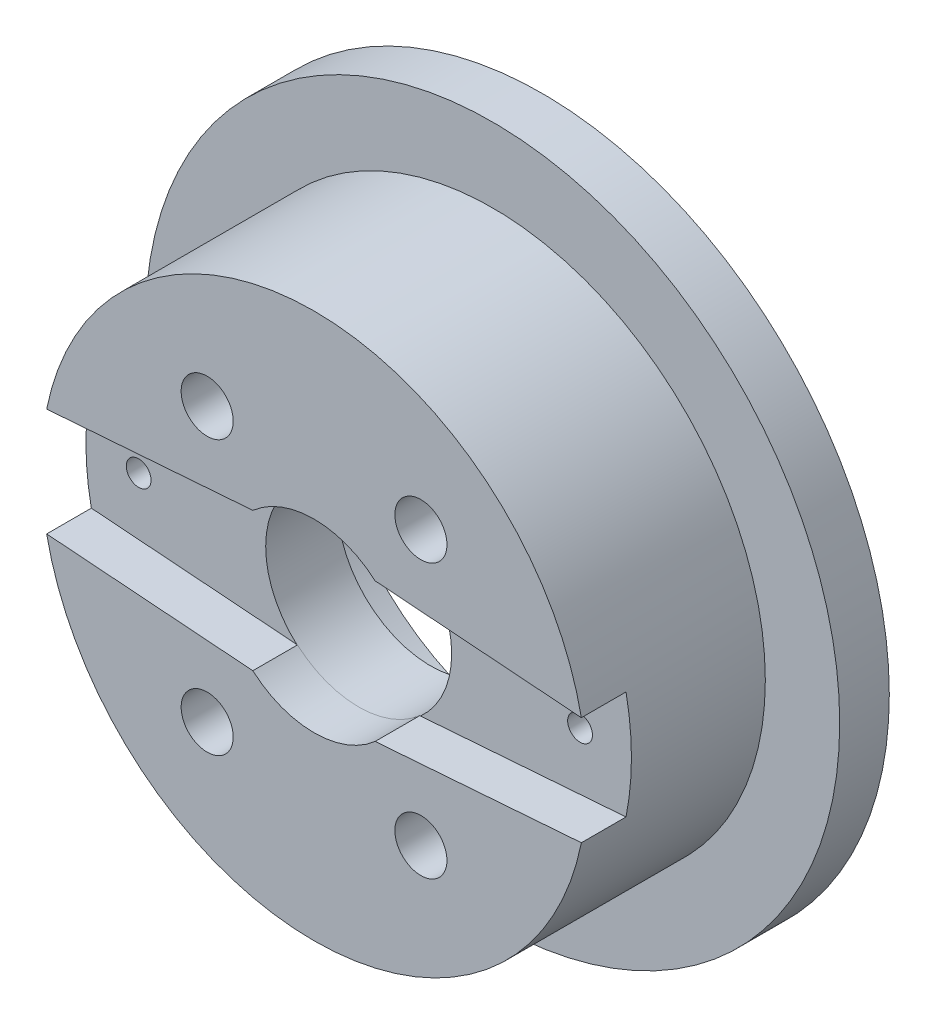
ISO-10303-21;
HEADER;
FILE_DESCRIPTION(('STEP AP214'),'2;1');
FILE_NAME('part.step','',(''),(''),'','','');
FILE_SCHEMA(('AUTOMOTIVE_DESIGN { 1 0 10303 214 1 1 1 1 }'));
ENDSEC;
DATA;
#1=APPLICATION_CONTEXT('core data for automotive mechanical design processes');
#2=APPLICATION_PROTOCOL_DEFINITION('international standard','automotive_design',2000,#1);
#3=PRODUCT_CONTEXT('',#1,'mechanical');
#4=PRODUCT('Part','Part','',(#3));
#5=PRODUCT_RELATED_PRODUCT_CATEGORY('part','',(#4));
#6=PRODUCT_DEFINITION_FORMATION('','',#4);
#7=PRODUCT_DEFINITION_CONTEXT('part definition',#1,'design');
#8=PRODUCT_DEFINITION('design','',#6,#7);
#9=PRODUCT_DEFINITION_SHAPE('','',#8);
#10=(LENGTH_UNIT() NAMED_UNIT(*) SI_UNIT(.MILLI.,.METRE.));
#11=(NAMED_UNIT(*) PLANE_ANGLE_UNIT() SI_UNIT($,.RADIAN.));
#12=(NAMED_UNIT(*) SI_UNIT($,.STERADIAN.) SOLID_ANGLE_UNIT());
#13=UNCERTAINTY_MEASURE_WITH_UNIT(LENGTH_MEASURE(1.E-05),#10,'distance_accuracy_value','');
#14=(GEOMETRIC_REPRESENTATION_CONTEXT(3) GLOBAL_UNCERTAINTY_ASSIGNED_CONTEXT((#13)) GLOBAL_UNIT_ASSIGNED_CONTEXT((#10,
#11,#12)) REPRESENTATION_CONTEXT('',''));
#15=CARTESIAN_POINT('',(0.,0.,0.));
#16=DIRECTION('',(0.,0.,1.));
#17=DIRECTION('',(1.,0.,0.));
#18=AXIS2_PLACEMENT_3D('',#15,#16,#17);
#19=CARTESIAN_POINT('',(0.,0.,0.));
#20=DIRECTION('',(0.,0.,1.));
#21=DIRECTION('',(1.,0.,0.));
#22=AXIS2_PLACEMENT_3D('',#19,#20,#21);
#23=CYLINDRICAL_SURFACE('',#22,9.);
#24=CARTESIAN_POINT('',(0.,0.,-7.4));
#25=DIRECTION('',(0.,0.,1.));
#26=DIRECTION('',(1.,0.,0.));
#27=AXIS2_PLACEMENT_3D('',#24,#25,#26);
#28=CIRCLE('',#27,9.);
#29=CARTESIAN_POINT('',(8.98629343397973,0.49651819544979,-7.4));
#30=VERTEX_POINT('',#29);
#31=CARTESIAN_POINT('',(-8.98682620345552,0.486780021041482,-7.4));
#32=VERTEX_POINT('',#31);
#33=EDGE_CURVE('E210',#30,#32,#28,.T.);
#34=ORIENTED_EDGE('',*,*,#33,.F.);
#35=DIRECTION('',(0.,0.,1.));
#36=VECTOR('',#35,1.);
#37=CARTESIAN_POINT('',(8.98629343397974,0.49651819544981,-2.8));
#38=LINE('',#37,#36);
#39=CARTESIAN_POINT('',(8.98629343397973,0.49651819544979,-2.9));
#40=VERTEX_POINT('',#39);
#41=EDGE_CURVE('E243',#30,#40,#38,.T.);
#42=ORIENTED_EDGE('',*,*,#41,.T.);
#43=CARTESIAN_POINT('',(0.,0.,-2.9));
#44=DIRECTION('',(0.,0.,1.));
#45=DIRECTION('',(1.,0.,0.));
#46=AXIS2_PLACEMENT_3D('',#43,#44,#45);
#47=CIRCLE('',#46,9.);
#48=CARTESIAN_POINT('',(6.09458966730571,6.62238452426091,-2.9));
#49=VERTEX_POINT('',#48);
#50=EDGE_CURVE('E185',#40,#49,#47,.T.);
#51=ORIENTED_EDGE('',*,*,#50,.T.);
#52=CARTESIAN_POINT('',(4.95125671642993,7.51565412509167,-2.9));
#53=VERTEX_POINT('',#52);
#54=EDGE_CURVE('E192',#49,#53,#47,.T.);
#55=ORIENTED_EDGE('',*,*,#54,.T.);
#56=CARTESIAN_POINT('',(-4.95125671642993,7.51565412509167,-2.9));
#57=VERTEX_POINT('',#56);
#58=EDGE_CURVE('E197',#53,#57,#47,.T.);
#59=ORIENTED_EDGE('',*,*,#58,.T.);
#60=CARTESIAN_POINT('',(-6.09458966730571,6.62238452426091,-2.9));
#61=VERTEX_POINT('',#60);
#62=EDGE_CURVE('E200',#57,#61,#47,.T.);
#63=ORIENTED_EDGE('',*,*,#62,.T.);
#64=CARTESIAN_POINT('',(-8.98682620345553,0.486780021041481,-2.9));
#65=VERTEX_POINT('',#64);
#66=EDGE_CURVE('E203',#61,#65,#47,.T.);
#67=ORIENTED_EDGE('',*,*,#66,.T.);
#68=DIRECTION('',(0.,0.,1.));
#69=VECTOR('',#68,1.);
#70=CARTESIAN_POINT('',(-8.98682620345552,0.486780021041482,-2.8));
#71=LINE('',#70,#69);
#72=EDGE_CURVE('E251',#65,#32,#71,.F.);
#73=ORIENTED_EDGE('',*,*,#72,.T.);
#74=EDGE_LOOP('',(#34,#42,#51,#55,#59,#63,#67,#73));
#75=FACE_BOUND('',#74,.T.);
#76=ADVANCED_FACE('F32',(#75),#23,.F.);
#77=CARTESIAN_POINT('',(-11.,0.,0.));
#78=DIRECTION('',(0.,0.,-1.));
#79=DIRECTION('',(-1.,0.,0.));
#80=AXIS2_PLACEMENT_3D('',#77,#78,#79);
#81=PLANE('',#80);
#82=DIRECTION('',(-0.997224303626801,-0.0744559484261798,0.));
#83=VECTOR('',#82,1.);
#84=CARTESIAN_POINT('',(2.46325017898811,-2.80446302050426,0.));
#85=LINE('',#84,#83);
#86=CARTESIAN_POINT('',(10.7811251698424,-2.18342393322763,0.));
#87=VERTEX_POINT('',#86);
#88=CARTESIAN_POINT('',(2.49188137304874,-2.80232532420002,0.));
#89=VERTEX_POINT('',#88);
#90=EDGE_CURVE('E271',#87,#89,#85,.T.);
#91=ORIENTED_EDGE('',*,*,#90,.F.);
#92=CARTESIAN_POINT('',(0.,0.,0.));
#93=DIRECTION('',(0.,0.,1.));
#94=DIRECTION('',(1.,0.,0.));
#95=AXIS2_PLACEMENT_3D('',#92,#93,#94);
#96=CIRCLE('',#95,11.);
#97=CARTESIAN_POINT('',(10.7811251698424,2.18342393322763,0.));
#98=VERTEX_POINT('',#97);
#99=EDGE_CURVE('E333',#87,#98,#96,.T.);
#100=ORIENTED_EDGE('',*,*,#99,.T.);
#101=DIRECTION('',(0.997224303626801,-0.0744559484261799,0.));
#102=VECTOR('',#101,1.);
#103=CARTESIAN_POINT('',(10.7811251698424,2.18342393322763,0.));
#104=LINE('',#103,#102);
#105=CARTESIAN_POINT('',(2.49188137304874,2.80232532420002,0.));
#106=VERTEX_POINT('',#105);
#107=EDGE_CURVE('E187',#106,#98,#104,.T.);
#108=ORIENTED_EDGE('',*,*,#107,.F.);
#109=CARTESIAN_POINT('',(0.,0.,0.));
#110=DIRECTION('',(0.,0.,1.));
#111=DIRECTION('',(1.,0.,0.));
#112=AXIS2_PLACEMENT_3D('',#109,#110,#111);
#113=CIRCLE('',#112,3.75);
#114=EDGE_CURVE('E418',#89,#106,#113,.T.);
#115=ORIENTED_EDGE('',*,*,#114,.F.);
#116=EDGE_LOOP('',(#91,#100,#108,#115));
#117=FACE_BOUND('',#116,.T.);
#118=CARTESIAN_POINT('',(8.9273894308283,0.,0.));
#119=DIRECTION('',(0.,0.,-1.));
#120=DIRECTION('',(-1.,0.,0.));
#121=AXIS2_PLACEMENT_3D('',#118,#119,#120);
#122=CIRCLE('',#121,0.500000000000001);
#123=CARTESIAN_POINT('',(8.4273894308283,0.,0.));
#124=VERTEX_POINT('',#123);
#125=EDGE_CURVE('E245',#124,#124,#122,.T.);
#126=ORIENTED_EDGE('',*,*,#125,.T.);
#127=EDGE_LOOP('',(#126));
#128=FACE_BOUND('',#127,.T.);
#129=ADVANCED_FACE('F416',(#117,#128),#81,.F.);
#130=DIRECTION('',(-0.997224267834601,0.0744564278067589,0.));
#131=VECTOR('',#130,1.);
#132=CARTESIAN_POINT('',(-10.7819650213995,-2.17927287812196,0.));
#133=LINE('',#132,#131);
#134=CARTESIAN_POINT('',(-2.49688573127066,-2.79786733870228,0.));
#135=VERTEX_POINT('',#134);
#136=CARTESIAN_POINT('',(-10.7819650213995,-2.17927287812196,0.));
#137=VERTEX_POINT('',#136);
#138=EDGE_CURVE('E276',#135,#137,#133,.T.);
#139=ORIENTED_EDGE('',*,*,#138,.F.);
#140=CARTESIAN_POINT('',(-2.49688573127066,2.79786733870228,0.));
#141=VERTEX_POINT('',#140);
#142=EDGE_CURVE('E427',#141,#135,#113,.T.);
#143=ORIENTED_EDGE('',*,*,#142,.F.);
#144=DIRECTION('',(0.997224267834601,0.0744564278067591,0.));
#145=VECTOR('',#144,1.);
#146=CARTESIAN_POINT('',(-2.4683221584025,2.8,0.));
#147=LINE('',#146,#145);
#148=CARTESIAN_POINT('',(-10.7819650213995,2.17927287812196,0.));
#149=VERTEX_POINT('',#148);
#150=EDGE_CURVE('E298',#149,#141,#147,.T.);
#151=ORIENTED_EDGE('',*,*,#150,.F.);
#152=EDGE_CURVE('E318',#149,#137,#96,.T.);
#153=ORIENTED_EDGE('',*,*,#152,.T.);
#154=EDGE_LOOP('',(#139,#143,#151,#153));
#155=FACE_BOUND('',#154,.T.);
#156=CARTESIAN_POINT('',(-8.87261056917171,0.,0.));
#157=DIRECTION('',(0.,0.,-1.));
#158=DIRECTION('',(-1.,0.,0.));
#159=AXIS2_PLACEMENT_3D('',#156,#157,#158);
#160=CIRCLE('',#159,0.500000000000001);
#161=CARTESIAN_POINT('',(-9.37261056917171,0.,0.));
#162=VERTEX_POINT('',#161);
#163=EDGE_CURVE('E256',#162,#162,#160,.T.);
#164=ORIENTED_EDGE('',*,*,#163,.T.);
#165=EDGE_LOOP('',(#164));
#166=FACE_BOUND('',#165,.T.);
#167=ADVANCED_FACE('F448',(#155,#166),#81,.F.);
#168=CARTESIAN_POINT('',(0.,0.,0.));
#169=DIRECTION('',(0.,0.,1.));
#170=DIRECTION('',(1.,0.,0.));
#171=AXIS2_PLACEMENT_3D('',#168,#169,#170);
#172=CYLINDRICAL_SURFACE('',#171,3.75);
#173=CARTESIAN_POINT('',(0.,0.,-2.9));
#174=DIRECTION('',(0.,0.,1.));
#175=DIRECTION('',(1.,0.,0.));
#176=AXIS2_PLACEMENT_3D('',#173,#174,#175);
#177=CIRCLE('',#176,3.75);
#178=CARTESIAN_POINT('',(3.75,0.,-2.9));
#179=VERTEX_POINT('',#178);
#180=EDGE_CURVE('E184',#179,#179,#177,.T.);
#181=ORIENTED_EDGE('',*,*,#180,.F.);
#182=EDGE_LOOP('',(#181));
#183=FACE_BOUND('',#182,.T.);
#184=EDGE_CURVE('E335',#106,#141,#113,.T.);
#185=ORIENTED_EDGE('',*,*,#184,.T.);
#186=ORIENTED_EDGE('',*,*,#142,.T.);
#187=CARTESIAN_POINT('',(0.,0.,0.));
#188=DIRECTION('',(0.,0.,1.));
#189=DIRECTION('',(1.,0.,0.));
#190=AXIS2_PLACEMENT_3D('',#187,#188,#189);
#191=CIRCLE('',#190,3.75);
#192=EDGE_CURVE('E290',#89,#135,#191,.F.);
#193=ORIENTED_EDGE('',*,*,#192,.F.);
#194=ORIENTED_EDGE('',*,*,#114,.T.);
#195=EDGE_LOOP('',(#185,#186,#193,#194));
#196=FACE_BOUND('',#195,.T.);
#197=ADVANCED_FACE('F34',(#183,#196),#172,.F.);
#198=CARTESIAN_POINT('',(-3.75,0.,-2.9));
#199=DIRECTION('',(0.,0.,1.));
#200=DIRECTION('',(1.,0.,0.));
#201=AXIS2_PLACEMENT_3D('',#198,#199,#200);
#202=PLANE('',#201);
#203=CARTESIAN_POINT('',(-4.95125671642995,-7.51565412509166,-2.9));
#204=VERTEX_POINT('',#203);
#205=CARTESIAN_POINT('',(4.95125671642995,-7.51565412509166,-2.9));
#206=VERTEX_POINT('',#205);
#207=EDGE_CURVE('E163',#204,#206,#47,.T.);
#208=ORIENTED_EDGE('',*,*,#207,.F.);
#209=CARTESIAN_POINT('',(-4.30963032727962,-5.51607527524705,-2.9));
#210=DIRECTION('',(0.,0.,-1.));
#211=DIRECTION('',(-1.,0.,0.));
#212=AXIS2_PLACEMENT_3D('',#209,#210,#211);
#213=CIRCLE('',#212,2.1);
#214=CARTESIAN_POINT('',(-6.0945896673057,-6.62238452426092,-2.9));
#215=VERTEX_POINT('',#214);
#216=EDGE_CURVE('E169',#215,#204,#213,.T.);
#217=ORIENTED_EDGE('',*,*,#216,.F.);
#218=CARTESIAN_POINT('',(-8.98682620345553,-0.486780021041487,-2.9));
#219=VERTEX_POINT('',#218);
#220=EDGE_CURVE('E162',#219,#215,#47,.T.);
#221=ORIENTED_EDGE('',*,*,#220,.F.);
#222=CARTESIAN_POINT('',(-8.87261056917171,0.,-2.9));
#223=DIRECTION('',(0.,0.,1.));
#224=DIRECTION('',(1.,0.,0.));
#225=AXIS2_PLACEMENT_3D('',#222,#223,#224);
#226=CIRCLE('',#225,0.500000000000001);
#227=EDGE_CURVE('E253',#219,#65,#226,.T.);
#228=ORIENTED_EDGE('',*,*,#227,.T.);
#229=ORIENTED_EDGE('',*,*,#66,.F.);
#230=CARTESIAN_POINT('',(-4.30963032727962,5.51607527524705,-2.9));
#231=DIRECTION('',(0.,0.,1.));
#232=DIRECTION('',(1.,0.,0.));
#233=AXIS2_PLACEMENT_3D('',#230,#231,#232);
#234=CIRCLE('',#233,2.1);
#235=EDGE_CURVE('E11',#61,#57,#234,.T.);
#236=ORIENTED_EDGE('',*,*,#235,.T.);
#237=ORIENTED_EDGE('',*,*,#58,.F.);
#238=CARTESIAN_POINT('',(4.30963032727962,5.51607527524705,-2.9));
#239=DIRECTION('',(0.,0.,1.));
#240=DIRECTION('',(1.,0.,0.));
#241=AXIS2_PLACEMENT_3D('',#238,#239,#240);
#242=CIRCLE('',#241,2.1);
#243=EDGE_CURVE('E41',#53,#49,#242,.T.);
#244=ORIENTED_EDGE('',*,*,#243,.T.);
#245=ORIENTED_EDGE('',*,*,#50,.F.);
#246=CARTESIAN_POINT('',(8.9273894308283,0.,-2.9));
#247=DIRECTION('',(0.,0.,1.));
#248=DIRECTION('',(1.,0.,0.));
#249=AXIS2_PLACEMENT_3D('',#246,#247,#248);
#250=CIRCLE('',#249,0.500000000000001);
#251=CARTESIAN_POINT('',(8.98629343397973,-0.496518195449811,-2.9));
#252=VERTEX_POINT('',#251);
#253=EDGE_CURVE('E241',#40,#252,#250,.T.);
#254=ORIENTED_EDGE('',*,*,#253,.T.);
#255=CARTESIAN_POINT('',(6.0945896673057,-6.62238452426092,-2.9));
#256=VERTEX_POINT('',#255);
#257=EDGE_CURVE('E165',#256,#252,#47,.T.);
#258=ORIENTED_EDGE('',*,*,#257,.F.);
#259=CARTESIAN_POINT('',(4.30963032727962,-5.51607527524705,-2.9));
#260=DIRECTION('',(0.,0.,-1.));
#261=DIRECTION('',(1.,0.,0.));
#262=AXIS2_PLACEMENT_3D('',#259,#260,#261);
#263=CIRCLE('',#262,2.1);
#264=EDGE_CURVE('E218',#206,#256,#263,.T.);
#265=ORIENTED_EDGE('',*,*,#264,.F.);
#266=EDGE_LOOP('',(#208,#217,#221,#228,#229,#236,#237,#244,#245,#254,#258,#265));
#267=FACE_BOUND('',#266,.T.);
#268=ORIENTED_EDGE('',*,*,#180,.T.);
#269=EDGE_LOOP('',(#268));
#270=FACE_BOUND('',#269,.T.);
#271=ADVANCED_FACE('F175',(#267,#270),#202,.F.);
#272=ORIENTED_EDGE('',*,*,#220,.T.);
#273=EDGE_CURVE('E158',#215,#204,#47,.T.);
#274=ORIENTED_EDGE('',*,*,#273,.T.);
#275=ORIENTED_EDGE('',*,*,#207,.T.);
#276=EDGE_CURVE('E190',#206,#256,#47,.T.);
#277=ORIENTED_EDGE('',*,*,#276,.T.);
#278=ORIENTED_EDGE('',*,*,#257,.T.);
#279=DIRECTION('',(0.,0.,1.));
#280=VECTOR('',#279,1.);
#281=CARTESIAN_POINT('',(8.98629343397974,-0.49651819544981,-2.8));
#282=LINE('',#281,#280);
#283=CARTESIAN_POINT('',(8.98629343397974,-0.49651819544981,-7.4));
#284=VERTEX_POINT('',#283);
#285=EDGE_CURVE('E239',#252,#284,#282,.F.);
#286=ORIENTED_EDGE('',*,*,#285,.T.);
#287=CARTESIAN_POINT('',(-8.98682620345553,-0.486780021041487,-7.4));
#288=VERTEX_POINT('',#287);
#289=EDGE_CURVE('E205',#288,#284,#28,.T.);
#290=ORIENTED_EDGE('',*,*,#289,.F.);
#291=DIRECTION('',(0.,0.,1.));
#292=VECTOR('',#291,1.);
#293=CARTESIAN_POINT('',(-8.98682620345552,-0.486780021041482,-2.8));
#294=LINE('',#293,#292);
#295=EDGE_CURVE('E183',#288,#219,#294,.T.);
#296=ORIENTED_EDGE('',*,*,#295,.T.);
#297=EDGE_LOOP('',(#272,#274,#275,#277,#278,#286,#290,#296));
#298=FACE_BOUND('',#297,.T.);
#299=ADVANCED_FACE('F181',(#298),#23,.F.);
#300=CARTESIAN_POINT('',(-9.,0.,-7.4));
#301=DIRECTION('',(0.,0.,1.));
#302=DIRECTION('',(1.,0.,0.));
#303=AXIS2_PLACEMENT_3D('',#300,#301,#302);
#304=PLANE('',#303);
#305=CARTESIAN_POINT('',(0.,0.,-7.4));
#306=DIRECTION('',(0.,0.,1.));
#307=DIRECTION('',(1.,0.,0.));
#308=AXIS2_PLACEMENT_3D('',#305,#306,#307);
#309=CIRCLE('',#308,14.);
#310=CARTESIAN_POINT('',(14.,0.,-7.4));
#311=VERTEX_POINT('',#310);
#312=EDGE_CURVE('E484',#311,#311,#309,.T.);
#313=ORIENTED_EDGE('',*,*,#312,.F.);
#314=EDGE_LOOP('',(#313));
#315=FACE_BOUND('',#314,.T.);
#316=ORIENTED_EDGE('',*,*,#289,.T.);
#317=CARTESIAN_POINT('',(8.9273894308283,0.,-7.4));
#318=DIRECTION('',(0.,0.,1.));
#319=DIRECTION('',(1.,0.,0.));
#320=AXIS2_PLACEMENT_3D('',#317,#318,#319);
#321=CIRCLE('',#320,0.500000000000001);
#322=EDGE_CURVE('E235',#284,#30,#321,.T.);
#323=ORIENTED_EDGE('',*,*,#322,.T.);
#324=ORIENTED_EDGE('',*,*,#33,.T.);
#325=CARTESIAN_POINT('',(-8.87261056917171,0.,-7.4));
#326=DIRECTION('',(0.,0.,1.));
#327=DIRECTION('',(1.,0.,0.));
#328=AXIS2_PLACEMENT_3D('',#325,#326,#327);
#329=CIRCLE('',#328,0.500000000000001);
#330=EDGE_CURVE('E248',#32,#288,#329,.T.);
#331=ORIENTED_EDGE('',*,*,#330,.T.);
#332=EDGE_LOOP('',(#316,#323,#324,#331));
#333=FACE_BOUND('',#332,.T.);
#334=ADVANCED_FACE('F452',(#315,#333),#304,.F.);
#335=CARTESIAN_POINT('',(0.,0.,0.));
#336=DIRECTION('',(0.,0.,1.));
#337=DIRECTION('',(1.,0.,0.));
#338=AXIS2_PLACEMENT_3D('',#335,#336,#337);
#339=CYLINDRICAL_SURFACE('',#338,14.);
#340=CARTESIAN_POINT('',(0.,0.,-5.4));
#341=DIRECTION('',(0.,0.,1.));
#342=DIRECTION('',(1.,0.,0.));
#343=AXIS2_PLACEMENT_3D('',#340,#341,#342);
#344=CIRCLE('',#343,14.);
#345=CARTESIAN_POINT('',(14.,0.,-5.4));
#346=VERTEX_POINT('',#345);
#347=EDGE_CURVE('E481',#346,#346,#344,.T.);
#348=ORIENTED_EDGE('',*,*,#347,.F.);
#349=EDGE_LOOP('',(#348));
#350=FACE_BOUND('',#349,.T.);
#351=ORIENTED_EDGE('',*,*,#312,.T.);
#352=EDGE_LOOP('',(#351));
#353=FACE_BOUND('',#352,.T.);
#354=ADVANCED_FACE('F457',(#350,#353),#339,.T.);
#355=CARTESIAN_POINT('',(-14.,0.,-5.4));
#356=DIRECTION('',(0.,0.,-1.));
#357=DIRECTION('',(-1.,0.,0.));
#358=AXIS2_PLACEMENT_3D('',#355,#356,#357);
#359=PLANE('',#358);
#360=CARTESIAN_POINT('',(0.,0.,-5.4));
#361=DIRECTION('',(0.,0.,1.));
#362=DIRECTION('',(1.,0.,0.));
#363=AXIS2_PLACEMENT_3D('',#360,#361,#362);
#364=CIRCLE('',#363,11.);
#365=CARTESIAN_POINT('',(11.,0.,-5.4));
#366=VERTEX_POINT('',#365);
#367=EDGE_CURVE('E400',#366,#366,#364,.T.);
#368=ORIENTED_EDGE('',*,*,#367,.F.);
#369=EDGE_LOOP('',(#368));
#370=FACE_BOUND('',#369,.T.);
#371=ORIENTED_EDGE('',*,*,#347,.T.);
#372=EDGE_LOOP('',(#371));
#373=FACE_BOUND('',#372,.T.);
#374=ADVANCED_FACE('F440',(#370,#373),#359,.F.);
#375=CARTESIAN_POINT('',(0.,0.,0.));
#376=DIRECTION('',(0.,0.,1.));
#377=DIRECTION('',(1.,0.,0.));
#378=AXIS2_PLACEMENT_3D('',#375,#376,#377);
#379=CYLINDRICAL_SURFACE('',#378,11.);
#380=ORIENTED_EDGE('',*,*,#152,.F.);
#381=DIRECTION('',(0.,0.,-1.));
#382=VECTOR('',#381,1.);
#383=CARTESIAN_POINT('',(-10.7819650213995,2.17927287812196,1.8));
#384=LINE('',#383,#382);
#385=CARTESIAN_POINT('',(-10.7819650213995,2.17927287812196,1.8));
#386=VERTEX_POINT('',#385);
#387=EDGE_CURVE('E324',#386,#149,#384,.T.);
#388=ORIENTED_EDGE('',*,*,#387,.F.);
#389=CARTESIAN_POINT('',(0.,0.,1.8));
#390=DIRECTION('',(0.,0.,1.));
#391=DIRECTION('',(1.,0.,0.));
#392=AXIS2_PLACEMENT_3D('',#389,#390,#391);
#393=CIRCLE('',#392,11.);
#394=CARTESIAN_POINT('',(10.7811251698424,2.18342393322763,1.8));
#395=VERTEX_POINT('',#394);
#396=EDGE_CURVE('E300',#395,#386,#393,.T.);
#397=ORIENTED_EDGE('',*,*,#396,.F.);
#398=DIRECTION('',(0.,0.,-1.));
#399=VECTOR('',#398,1.);
#400=CARTESIAN_POINT('',(10.7811251698424,2.18342393322763,1.8));
#401=LINE('',#400,#399);
#402=EDGE_CURVE('E320',#395,#98,#401,.T.);
#403=ORIENTED_EDGE('',*,*,#402,.T.);
#404=ORIENTED_EDGE('',*,*,#99,.F.);
#405=DIRECTION('',(0.,0.,-1.));
#406=VECTOR('',#405,1.);
#407=CARTESIAN_POINT('',(10.7811251698424,-2.18342393322763,1.8));
#408=LINE('',#407,#406);
#409=CARTESIAN_POINT('',(10.7811251698424,-2.18342393322763,1.8));
#410=VERTEX_POINT('',#409);
#411=EDGE_CURVE('E287',#410,#87,#408,.T.);
#412=ORIENTED_EDGE('',*,*,#411,.F.);
#413=CARTESIAN_POINT('',(0.,0.,1.8));
#414=DIRECTION('',(0.,0.,1.));
#415=DIRECTION('',(1.,0.,0.));
#416=AXIS2_PLACEMENT_3D('',#413,#414,#415);
#417=CIRCLE('',#416,11.);
#418=CARTESIAN_POINT('',(-10.7819650213995,-2.17927287812196,1.8));
#419=VERTEX_POINT('',#418);
#420=EDGE_CURVE('E260',#419,#410,#417,.T.);
#421=ORIENTED_EDGE('',*,*,#420,.F.);
#422=DIRECTION('',(0.,0.,-1.));
#423=VECTOR('',#422,1.);
#424=CARTESIAN_POINT('',(-10.7819650213995,-2.17927287812196,1.8));
#425=LINE('',#424,#423);
#426=EDGE_CURVE('E270',#419,#137,#425,.T.);
#427=ORIENTED_EDGE('',*,*,#426,.T.);
#428=EDGE_LOOP('',(#380,#388,#397,#403,#404,#412,#421,#427));
#429=FACE_BOUND('',#428,.T.);
#430=ORIENTED_EDGE('',*,*,#367,.T.);
#431=EDGE_LOOP('',(#430));
#432=FACE_BOUND('',#431,.T.);
#433=ADVANCED_FACE('F382',(#429,#432),#379,.T.);
#434=CARTESIAN_POINT('',(0.,0.,1.8));
#435=DIRECTION('',(0.,0.,-1.));
#436=DIRECTION('',(-1.,0.,0.));
#437=AXIS2_PLACEMENT_3D('',#434,#435,#436);
#438=CYLINDRICAL_SURFACE('',#437,3.73264172907886);
#439=CARTESIAN_POINT('',(0.,0.,0.));
#440=DIRECTION('',(0.,0.,-1.));
#441=DIRECTION('',(1.,0.,0.));
#442=AXIS2_PLACEMENT_3D('',#439,#440,#441);
#443=CIRCLE('',#442,3.73264172907886);
#444=CARTESIAN_POINT('',(-2.4683221584025,2.8,0.));
#445=VERTEX_POINT('',#444);
#446=CARTESIAN_POINT('',(2.46325017898811,2.80446302050426,0.));
#447=VERTEX_POINT('',#446);
#448=EDGE_CURVE('E293',#445,#447,#443,.T.);
#449=ORIENTED_EDGE('',*,*,#448,.T.);
#450=DIRECTION('',(0.,0.,-1.));
#451=VECTOR('',#450,1.);
#452=CARTESIAN_POINT('',(2.46325017898811,2.80446302050426,1.8));
#453=LINE('',#452,#451);
#454=CARTESIAN_POINT('',(2.46325017898811,2.80446302050426,1.8));
#455=VERTEX_POINT('',#454);
#456=EDGE_CURVE('E323',#455,#447,#453,.T.);
#457=ORIENTED_EDGE('',*,*,#456,.F.);
#458=CARTESIAN_POINT('',(0.,0.,1.8));
#459=DIRECTION('',(0.,0.,-1.));
#460=DIRECTION('',(1.,0.,0.));
#461=AXIS2_PLACEMENT_3D('',#458,#459,#460);
#462=CIRCLE('',#461,3.73264172907886);
#463=CARTESIAN_POINT('',(-2.4683221584025,2.8,1.8));
#464=VERTEX_POINT('',#463);
#465=EDGE_CURVE('E294',#464,#455,#462,.T.);
#466=ORIENTED_EDGE('',*,*,#465,.F.);
#467=DIRECTION('',(0.,0.,-1.));
#468=VECTOR('',#467,1.);
#469=CARTESIAN_POINT('',(-2.4683221584025,2.8,1.8));
#470=LINE('',#469,#468);
#471=EDGE_CURVE('E304',#464,#445,#470,.T.);
#472=ORIENTED_EDGE('',*,*,#471,.T.);
#473=EDGE_LOOP('',(#449,#457,#466,#472));
#474=FACE_BOUND('',#473,.T.);
#475=ADVANCED_FACE('F432',(#474),#438,.F.);
#476=CARTESIAN_POINT('',(10.7811251698424,2.18342393322763,1.8));
#477=DIRECTION('',(0.0744559484261799,0.997224303626801,0.));
#478=DIRECTION('',(-0.997224303626801,0.0744559484261799,0.));
#479=AXIS2_PLACEMENT_3D('',#476,#477,#478);
#480=PLANE('',#479);
#481=EDGE_CURVE('E307',#447,#106,#104,.T.);
#482=ORIENTED_EDGE('',*,*,#481,.T.);
#483=ORIENTED_EDGE('',*,*,#107,.T.);
#484=ORIENTED_EDGE('',*,*,#402,.F.);
#485=DIRECTION('',(0.997224303626801,-0.0744559484261799,0.));
#486=VECTOR('',#485,1.);
#487=CARTESIAN_POINT('',(10.7811251698424,2.18342393322763,1.8));
#488=LINE('',#487,#486);
#489=EDGE_CURVE('E297',#455,#395,#488,.T.);
#490=ORIENTED_EDGE('',*,*,#489,.F.);
#491=ORIENTED_EDGE('',*,*,#456,.T.);
#492=EDGE_LOOP('',(#482,#483,#484,#490,#491));
#493=FACE_BOUND('',#492,.T.);
#494=ADVANCED_FACE('F411',(#493),#480,.F.);
#495=CARTESIAN_POINT('',(-2.4683221584025,2.8,1.8));
#496=DIRECTION('',(-0.0744564278067591,0.997224267834601,0.));
#497=DIRECTION('',(-0.997224267834601,-0.0744564278067591,0.));
#498=AXIS2_PLACEMENT_3D('',#495,#496,#497);
#499=PLANE('',#498);
#500=ORIENTED_EDGE('',*,*,#150,.T.);
#501=EDGE_CURVE('E311',#141,#445,#147,.T.);
#502=ORIENTED_EDGE('',*,*,#501,.T.);
#503=ORIENTED_EDGE('',*,*,#471,.F.);
#504=DIRECTION('',(0.997224267834601,0.0744564278067591,0.));
#505=VECTOR('',#504,1.);
#506=CARTESIAN_POINT('',(-2.4683221584025,2.8,1.8));
#507=LINE('',#506,#505);
#508=EDGE_CURVE('E302',#386,#464,#507,.T.);
#509=ORIENTED_EDGE('',*,*,#508,.F.);
#510=ORIENTED_EDGE('',*,*,#387,.T.);
#511=EDGE_LOOP('',(#500,#502,#503,#509,#510));
#512=FACE_BOUND('',#511,.T.);
#513=ADVANCED_FACE('F402',(#512),#499,.F.);
#514=CARTESIAN_POINT('',(0.,0.,1.8));
#515=DIRECTION('',(0.,0.,1.));
#516=DIRECTION('',(1.,0.,0.));
#517=AXIS2_PLACEMENT_3D('',#514,#515,#516);
#518=PLANE('',#517);
#519=CARTESIAN_POINT('',(4.30963032727962,5.51607527524705,1.8));
#520=DIRECTION('',(0.,0.,1.));
#521=DIRECTION('',(1.,0.,0.));
#522=AXIS2_PLACEMENT_3D('',#519,#520,#521);
#523=CIRCLE('',#522,1.05);
#524=CARTESIAN_POINT('',(5.35963032727962,5.51607527524705,1.8));
#525=VERTEX_POINT('',#524);
#526=EDGE_CURVE('E349',#525,#525,#523,.T.);
#527=ORIENTED_EDGE('',*,*,#526,.F.);
#528=EDGE_LOOP('',(#527));
#529=FACE_BOUND('',#528,.T.);
#530=CARTESIAN_POINT('',(-4.30963032727962,5.51607527524705,1.8));
#531=DIRECTION('',(0.,0.,1.));
#532=DIRECTION('',(1.,0.,0.));
#533=AXIS2_PLACEMENT_3D('',#530,#531,#532);
#534=CIRCLE('',#533,1.05);
#535=CARTESIAN_POINT('',(-3.25963032727962,5.51607527524705,1.8));
#536=VERTEX_POINT('',#535);
#537=EDGE_CURVE('E346',#536,#536,#534,.T.);
#538=ORIENTED_EDGE('',*,*,#537,.F.);
#539=EDGE_LOOP('',(#538));
#540=FACE_BOUND('',#539,.T.);
#541=ORIENTED_EDGE('',*,*,#465,.T.);
#542=ORIENTED_EDGE('',*,*,#489,.T.);
#543=ORIENTED_EDGE('',*,*,#396,.T.);
#544=ORIENTED_EDGE('',*,*,#508,.T.);
#545=EDGE_LOOP('',(#541,#542,#543,#544));
#546=FACE_BOUND('',#545,.T.);
#547=ADVANCED_FACE('F407',(#529,#540,#546),#518,.T.);
#548=CARTESIAN_POINT('',(0.,0.,0.));
#549=DIRECTION('',(0.,0.,1.));
#550=DIRECTION('',(1.,0.,0.));
#551=AXIS2_PLACEMENT_3D('',#548,#549,#550);
#552=PLANE('',#551);
#553=ORIENTED_EDGE('',*,*,#184,.F.);
#554=ORIENTED_EDGE('',*,*,#481,.F.);
#555=ORIENTED_EDGE('',*,*,#448,.F.);
#556=ORIENTED_EDGE('',*,*,#501,.F.);
#557=EDGE_LOOP('',(#553,#554,#555,#556));
#558=FACE_BOUND('',#557,.T.);
#559=ADVANCED_FACE('F423',(#558),#552,.F.);
#560=CARTESIAN_POINT('',(0.,0.,0.));
#561=DIRECTION('',(0.,0.,1.));
#562=DIRECTION('',(1.,0.,0.));
#563=AXIS2_PLACEMENT_3D('',#560,#561,#562);
#564=PLANE('',#563);
#565=CARTESIAN_POINT('',(2.4632501789881,-2.80446302050426,0.));
#566=VERTEX_POINT('',#565);
#567=EDGE_CURVE('E259',#89,#566,#85,.T.);
#568=ORIENTED_EDGE('',*,*,#567,.F.);
#569=ORIENTED_EDGE('',*,*,#192,.T.);
#570=CARTESIAN_POINT('',(-2.4683221584025,-2.8,0.));
#571=VERTEX_POINT('',#570);
#572=EDGE_CURVE('E264',#571,#135,#133,.T.);
#573=ORIENTED_EDGE('',*,*,#572,.F.);
#574=CARTESIAN_POINT('',(0.,0.,0.));
#575=DIRECTION('',(0.,0.,-1.));
#576=DIRECTION('',(1.,0.,0.));
#577=AXIS2_PLACEMENT_3D('',#574,#575,#576);
#578=CIRCLE('',#577,3.73264172907886);
#579=EDGE_CURVE('E274',#566,#571,#578,.T.);
#580=ORIENTED_EDGE('',*,*,#579,.F.);
#581=EDGE_LOOP('',(#568,#569,#573,#580));
#582=FACE_BOUND('',#581,.T.);
#583=ADVANCED_FACE('F528',(#582),#564,.F.);
#584=CARTESIAN_POINT('',(2.46325017898811,-2.80446302050426,1.8));
#585=DIRECTION('',(0.0744559484261798,-0.997224303626801,0.));
#586=DIRECTION('',(0.997224303626801,0.0744559484261798,0.));
#587=AXIS2_PLACEMENT_3D('',#584,#585,#586);
#588=PLANE('',#587);
#589=ORIENTED_EDGE('',*,*,#90,.T.);
#590=ORIENTED_EDGE('',*,*,#567,.T.);
#591=DIRECTION('',(0.,0.,-1.));
#592=VECTOR('',#591,1.);
#593=CARTESIAN_POINT('',(2.4632501789881,-2.80446302050426,1.8));
#594=LINE('',#593,#592);
#595=CARTESIAN_POINT('',(2.4632501789881,-2.80446302050426,1.8));
#596=VERTEX_POINT('',#595);
#597=EDGE_CURVE('E284',#596,#566,#594,.T.);
#598=ORIENTED_EDGE('',*,*,#597,.F.);
#599=DIRECTION('',(-0.997224303626801,-0.0744559484261798,0.));
#600=VECTOR('',#599,1.);
#601=CARTESIAN_POINT('',(2.46325017898811,-2.80446302050426,1.8));
#602=LINE('',#601,#600);
#603=EDGE_CURVE('E263',#410,#596,#602,.T.);
#604=ORIENTED_EDGE('',*,*,#603,.F.);
#605=ORIENTED_EDGE('',*,*,#411,.T.);
#606=EDGE_LOOP('',(#589,#590,#598,#604,#605));
#607=FACE_BOUND('',#606,.T.);
#608=ADVANCED_FACE('F386',(#607),#588,.F.);
#609=CARTESIAN_POINT('',(0.,0.,1.8));
#610=DIRECTION('',(0.,0.,-1.));
#611=DIRECTION('',(-1.,0.,0.));
#612=AXIS2_PLACEMENT_3D('',#609,#610,#611);
#613=CYLINDRICAL_SURFACE('',#612,3.73264172907886);
#614=ORIENTED_EDGE('',*,*,#579,.T.);
#615=DIRECTION('',(0.,0.,-1.));
#616=VECTOR('',#615,1.);
#617=CARTESIAN_POINT('',(-2.4683221584025,-2.8,1.8));
#618=LINE('',#617,#616);
#619=CARTESIAN_POINT('',(-2.4683221584025,-2.8,1.8));
#620=VERTEX_POINT('',#619);
#621=EDGE_CURVE('E281',#620,#571,#618,.T.);
#622=ORIENTED_EDGE('',*,*,#621,.F.);
#623=CARTESIAN_POINT('',(0.,0.,1.8));
#624=DIRECTION('',(0.,0.,-1.));
#625=DIRECTION('',(1.,0.,0.));
#626=AXIS2_PLACEMENT_3D('',#623,#624,#625);
#627=CIRCLE('',#626,3.73264172907886);
#628=EDGE_CURVE('E266',#596,#620,#627,.T.);
#629=ORIENTED_EDGE('',*,*,#628,.F.);
#630=ORIENTED_EDGE('',*,*,#597,.T.);
#631=EDGE_LOOP('',(#614,#622,#629,#630));
#632=FACE_BOUND('',#631,.T.);
#633=ADVANCED_FACE('F392',(#632),#613,.F.);
#634=CARTESIAN_POINT('',(-10.7819650213995,-2.17927287812196,1.8));
#635=DIRECTION('',(-0.0744564278067589,-0.997224267834601,0.));
#636=DIRECTION('',(0.997224267834601,-0.0744564278067589,0.));
#637=AXIS2_PLACEMENT_3D('',#634,#635,#636);
#638=PLANE('',#637);
#639=ORIENTED_EDGE('',*,*,#572,.T.);
#640=ORIENTED_EDGE('',*,*,#138,.T.);
#641=ORIENTED_EDGE('',*,*,#426,.F.);
#642=DIRECTION('',(-0.997224267834601,0.0744564278067589,0.));
#643=VECTOR('',#642,1.);
#644=CARTESIAN_POINT('',(-10.7819650213995,-2.17927287812196,1.8));
#645=LINE('',#644,#643);
#646=EDGE_CURVE('E268',#620,#419,#645,.T.);
#647=ORIENTED_EDGE('',*,*,#646,.F.);
#648=ORIENTED_EDGE('',*,*,#621,.T.);
#649=EDGE_LOOP('',(#639,#640,#641,#647,#648));
#650=FACE_BOUND('',#649,.T.);
#651=ADVANCED_FACE('F372',(#650),#638,.F.);
#652=CARTESIAN_POINT('',(0.,0.,1.8));
#653=DIRECTION('',(0.,0.,1.));
#654=DIRECTION('',(1.,0.,0.));
#655=AXIS2_PLACEMENT_3D('',#652,#653,#654);
#656=PLANE('',#655);
#657=CARTESIAN_POINT('',(4.30963032727962,-5.51607527524705,1.8));
#658=DIRECTION('',(0.,0.,1.));
#659=DIRECTION('',(1.,0.,0.));
#660=AXIS2_PLACEMENT_3D('',#657,#658,#659);
#661=CIRCLE('',#660,1.05);
#662=CARTESIAN_POINT('',(5.35963032727962,-5.51607527524705,1.8));
#663=VERTEX_POINT('',#662);
#664=EDGE_CURVE('E343',#663,#663,#661,.T.);
#665=ORIENTED_EDGE('',*,*,#664,.F.);
#666=EDGE_LOOP('',(#665));
#667=FACE_BOUND('',#666,.T.);
#668=CARTESIAN_POINT('',(-4.30963032727962,-5.51607527524705,1.8));
#669=DIRECTION('',(0.,0.,1.));
#670=DIRECTION('',(1.,0.,0.));
#671=AXIS2_PLACEMENT_3D('',#668,#669,#670);
#672=CIRCLE('',#671,1.05);
#673=CARTESIAN_POINT('',(-3.25963032727962,-5.51607527524705,1.8));
#674=VERTEX_POINT('',#673);
#675=EDGE_CURVE('E179',#674,#674,#672,.T.);
#676=ORIENTED_EDGE('',*,*,#675,.F.);
#677=EDGE_LOOP('',(#676));
#678=FACE_BOUND('',#677,.T.);
#679=ORIENTED_EDGE('',*,*,#420,.T.);
#680=ORIENTED_EDGE('',*,*,#603,.T.);
#681=ORIENTED_EDGE('',*,*,#628,.T.);
#682=ORIENTED_EDGE('',*,*,#646,.T.);
#683=EDGE_LOOP('',(#679,#680,#681,#682));
#684=FACE_BOUND('',#683,.T.);
#685=ADVANCED_FACE('F368',(#667,#678,#684),#656,.T.);
#686=CARTESIAN_POINT('',(-8.87261056917171,0.,-7.4));
#687=DIRECTION('',(0.,0.,1.));
#688=DIRECTION('',(1.,0.,0.));
#689=AXIS2_PLACEMENT_3D('',#686,#687,#688);
#690=CYLINDRICAL_SURFACE('',#689,0.500000000000001);
#691=ORIENTED_EDGE('',*,*,#330,.F.);
#692=ORIENTED_EDGE('',*,*,#72,.F.);
#693=ORIENTED_EDGE('',*,*,#227,.F.);
#694=ORIENTED_EDGE('',*,*,#295,.F.);
#695=EDGE_LOOP('',(#691,#692,#693,#694));
#696=FACE_BOUND('',#695,.T.);
#697=ORIENTED_EDGE('',*,*,#163,.F.);
#698=EDGE_LOOP('',(#697));
#699=FACE_BOUND('',#698,.T.);
#700=ADVANCED_FACE('F371',(#696,#699),#690,.F.);
#701=CARTESIAN_POINT('',(8.9273894308283,0.,-7.4));
#702=DIRECTION('',(0.,0.,1.));
#703=DIRECTION('',(1.,0.,0.));
#704=AXIS2_PLACEMENT_3D('',#701,#702,#703);
#705=CYLINDRICAL_SURFACE('',#704,0.500000000000001);
#706=ORIENTED_EDGE('',*,*,#322,.F.);
#707=ORIENTED_EDGE('',*,*,#285,.F.);
#708=ORIENTED_EDGE('',*,*,#253,.F.);
#709=ORIENTED_EDGE('',*,*,#41,.F.);
#710=EDGE_LOOP('',(#706,#707,#708,#709));
#711=FACE_BOUND('',#710,.T.);
#712=ORIENTED_EDGE('',*,*,#125,.F.);
#713=EDGE_LOOP('',(#712));
#714=FACE_BOUND('',#713,.T.);
#715=ADVANCED_FACE('F518',(#711,#714),#705,.F.);
#716=CARTESIAN_POINT('',(4.30963032727962,5.51607527524705,-2.9));
#717=DIRECTION('',(0.,0.,-1.));
#718=DIRECTION('',(-1.,0.,0.));
#719=AXIS2_PLACEMENT_3D('',#716,#717,#718);
#720=PLANE('',#719);
#721=CARTESIAN_POINT('',(4.30963032727962,5.51607527524705,-2.9));
#722=DIRECTION('',(0.,0.,-1.));
#723=DIRECTION('',(-1.,0.,0.));
#724=AXIS2_PLACEMENT_3D('',#721,#722,#723);
#725=CIRCLE('',#724,2.1);
#726=EDGE_CURVE('E229',#53,#49,#725,.T.);
#727=ORIENTED_EDGE('',*,*,#726,.F.);
#728=ORIENTED_EDGE('',*,*,#54,.F.);
#729=EDGE_LOOP('',(#727,#728));
#730=FACE_BOUND('',#729,.T.);
#731=ADVANCED_FACE('F515',(#730),#720,.F.);
#732=CARTESIAN_POINT('',(4.30963032727962,5.51607527524705,-0.9));
#733=DIRECTION('',(0.,0.,-1.));
#734=DIRECTION('',(-1.,0.,0.));
#735=AXIS2_PLACEMENT_3D('',#732,#733,#734);
#736=CYLINDRICAL_SURFACE('',#735,2.1);
#737=CARTESIAN_POINT('',(4.30963032727962,5.51607527524705,-0.9));
#738=DIRECTION('',(0.,0.,-1.));
#739=DIRECTION('',(-1.,0.,0.));
#740=AXIS2_PLACEMENT_3D('',#737,#738,#739);
#741=CIRCLE('',#740,2.1);
#742=CARTESIAN_POINT('',(2.20963032727962,5.51607527524705,-0.9));
#743=VERTEX_POINT('',#742);
#744=EDGE_CURVE('E232',#743,#743,#741,.T.);
#745=ORIENTED_EDGE('',*,*,#744,.F.);
#746=EDGE_LOOP('',(#745));
#747=FACE_BOUND('',#746,.T.);
#748=ORIENTED_EDGE('',*,*,#726,.T.);
#749=ORIENTED_EDGE('',*,*,#243,.F.);
#750=EDGE_LOOP('',(#748,#749));
#751=FACE_BOUND('',#750,.T.);
#752=ADVANCED_FACE('F509',(#747,#751),#736,.F.);
#753=CARTESIAN_POINT('',(4.30963032727962,5.51607527524705,-0.9));
#754=DIRECTION('',(0.,0.,-1.));
#755=DIRECTION('',(-1.,0.,0.));
#756=AXIS2_PLACEMENT_3D('',#753,#754,#755);
#757=PLANE('',#756);
#758=CARTESIAN_POINT('',(4.30963032727962,5.51607527524705,-0.9));
#759=DIRECTION('',(0.,0.,-1.));
#760=DIRECTION('',(-1.,0.,0.));
#761=AXIS2_PLACEMENT_3D('',#758,#759,#760);
#762=CIRCLE('',#761,1.05);
#763=CARTESIAN_POINT('',(3.25963032727962,5.51607527524705,-0.9));
#764=VERTEX_POINT('',#763);
#765=EDGE_CURVE('E36',#764,#764,#762,.T.);
#766=ORIENTED_EDGE('',*,*,#765,.F.);
#767=EDGE_LOOP('',(#766));
#768=FACE_BOUND('',#767,.T.);
#769=ORIENTED_EDGE('',*,*,#744,.T.);
#770=EDGE_LOOP('',(#769));
#771=FACE_BOUND('',#770,.T.);
#772=ADVANCED_FACE('F500',(#768,#771),#757,.T.);
#773=CARTESIAN_POINT('',(-4.30963032727962,5.51607527524705,-2.9));
#774=DIRECTION('',(0.,0.,1.));
#775=DIRECTION('',(1.,0.,0.));
#776=AXIS2_PLACEMENT_3D('',#773,#774,#775);
#777=PLANE('',#776);
#778=ORIENTED_EDGE('',*,*,#62,.F.);
#779=CARTESIAN_POINT('',(-4.30963032727962,5.51607527524705,-2.9));
#780=DIRECTION('',(0.,0.,-1.));
#781=DIRECTION('',(1.,0.,0.));
#782=AXIS2_PLACEMENT_3D('',#779,#780,#781);
#783=CIRCLE('',#782,2.1);
#784=EDGE_CURVE('E230',#61,#57,#783,.T.);
#785=ORIENTED_EDGE('',*,*,#784,.F.);
#786=EDGE_LOOP('',(#778,#785));
#787=FACE_BOUND('',#786,.T.);
#788=ADVANCED_FACE('F498',(#787),#777,.T.);
#789=CARTESIAN_POINT('',(-4.30963032727962,5.51607527524705,-0.9));
#790=DIRECTION('',(0.,0.,-1.));
#791=DIRECTION('',(-1.,0.,0.));
#792=AXIS2_PLACEMENT_3D('',#789,#790,#791);
#793=CYLINDRICAL_SURFACE('',#792,2.1);
#794=CARTESIAN_POINT('',(-4.30963032727962,5.51607527524705,-0.9));
#795=DIRECTION('',(0.,0.,-1.));
#796=DIRECTION('',(1.,0.,0.));
#797=AXIS2_PLACEMENT_3D('',#794,#795,#796);
#798=CIRCLE('',#797,2.1);
#799=CARTESIAN_POINT('',(-2.20963032727962,5.51607527524705,-0.9));
#800=VERTEX_POINT('',#799);
#801=EDGE_CURVE('E226',#800,#800,#798,.T.);
#802=ORIENTED_EDGE('',*,*,#801,.F.);
#803=EDGE_LOOP('',(#802));
#804=FACE_BOUND('',#803,.T.);
#805=ORIENTED_EDGE('',*,*,#784,.T.);
#806=ORIENTED_EDGE('',*,*,#235,.F.);
#807=EDGE_LOOP('',(#805,#806));
#808=FACE_BOUND('',#807,.T.);
#809=ADVANCED_FACE('F496',(#804,#808),#793,.F.);
#810=CARTESIAN_POINT('',(-4.30963032727962,5.51607527524705,-0.9));
#811=DIRECTION('',(0.,0.,1.));
#812=DIRECTION('',(1.,0.,0.));
#813=AXIS2_PLACEMENT_3D('',#810,#811,#812);
#814=PLANE('',#813);
#815=CARTESIAN_POINT('',(-4.30963032727962,5.51607527524705,-0.9));
#816=DIRECTION('',(0.,0.,1.));
#817=DIRECTION('',(1.,0.,0.));
#818=AXIS2_PLACEMENT_3D('',#815,#816,#817);
#819=CIRCLE('',#818,1.05);
#820=CARTESIAN_POINT('',(-3.25963032727962,5.51607527524705,-0.9));
#821=VERTEX_POINT('',#820);
#822=EDGE_CURVE('E347',#821,#821,#819,.T.);
#823=ORIENTED_EDGE('',*,*,#822,.T.);
#824=EDGE_LOOP('',(#823));
#825=FACE_BOUND('',#824,.T.);
#826=ORIENTED_EDGE('',*,*,#801,.T.);
#827=EDGE_LOOP('',(#826));
#828=FACE_BOUND('',#827,.T.);
#829=ADVANCED_FACE('F506',(#825,#828),#814,.F.);
#830=CARTESIAN_POINT('',(4.30963032727962,-5.51607527524705,-2.9));
#831=DIRECTION('',(0.,0.,1.));
#832=DIRECTION('',(1.,0.,0.));
#833=AXIS2_PLACEMENT_3D('',#830,#831,#832);
#834=PLANE('',#833);
#835=ORIENTED_EDGE('',*,*,#276,.F.);
#836=EDGE_CURVE('E55',#256,#206,#263,.T.);
#837=ORIENTED_EDGE('',*,*,#836,.F.);
#838=EDGE_LOOP('',(#835,#837));
#839=FACE_BOUND('',#838,.T.);
#840=ADVANCED_FACE('F215',(#839),#834,.T.);
#841=CARTESIAN_POINT('',(4.30963032727962,-5.51607527524705,-0.9));
#842=DIRECTION('',(0.,0.,-1.));
#843=DIRECTION('',(-1.,0.,0.));
#844=AXIS2_PLACEMENT_3D('',#841,#842,#843);
#845=CYLINDRICAL_SURFACE('',#844,2.1);
#846=CARTESIAN_POINT('',(4.30963032727962,-5.51607527524705,-0.9));
#847=DIRECTION('',(0.,0.,-1.));
#848=DIRECTION('',(1.,0.,0.));
#849=AXIS2_PLACEMENT_3D('',#846,#847,#848);
#850=CIRCLE('',#849,2.1);
#851=CARTESIAN_POINT('',(6.40963032727962,-5.51607527524705,-0.9));
#852=VERTEX_POINT('',#851);
#853=EDGE_CURVE('E219',#852,#852,#850,.T.);
#854=ORIENTED_EDGE('',*,*,#853,.F.);
#855=EDGE_LOOP('',(#854));
#856=FACE_BOUND('',#855,.T.);
#857=ORIENTED_EDGE('',*,*,#836,.T.);
#858=ORIENTED_EDGE('',*,*,#264,.T.);
#859=EDGE_LOOP('',(#857,#858));
#860=FACE_BOUND('',#859,.T.);
#861=ADVANCED_FACE('F217',(#856,#860),#845,.F.);
#862=CARTESIAN_POINT('',(4.30963032727962,-5.51607527524705,-0.9));
#863=DIRECTION('',(0.,0.,1.));
#864=DIRECTION('',(1.,0.,0.));
#865=AXIS2_PLACEMENT_3D('',#862,#863,#864);
#866=PLANE('',#865);
#867=CARTESIAN_POINT('',(4.30963032727962,-5.51607527524705,-0.9));
#868=DIRECTION('',(0.,0.,1.));
#869=DIRECTION('',(1.,0.,0.));
#870=AXIS2_PLACEMENT_3D('',#867,#868,#869);
#871=CIRCLE('',#870,1.05);
#872=CARTESIAN_POINT('',(5.35963032727962,-5.51607527524705,-0.9));
#873=VERTEX_POINT('',#872);
#874=EDGE_CURVE('E344',#873,#873,#871,.T.);
#875=ORIENTED_EDGE('',*,*,#874,.T.);
#876=EDGE_LOOP('',(#875));
#877=FACE_BOUND('',#876,.T.);
#878=ORIENTED_EDGE('',*,*,#853,.T.);
#879=EDGE_LOOP('',(#878));
#880=FACE_BOUND('',#879,.T.);
#881=ADVANCED_FACE('F614',(#877,#880),#866,.F.);
#882=CARTESIAN_POINT('',(-4.30963032727962,-5.51607527524705,-2.9));
#883=DIRECTION('',(0.,0.,-1.));
#884=DIRECTION('',(-1.,0.,0.));
#885=AXIS2_PLACEMENT_3D('',#882,#883,#884);
#886=PLANE('',#885);
#887=EDGE_CURVE('E48',#204,#215,#213,.T.);
#888=ORIENTED_EDGE('',*,*,#887,.F.);
#889=ORIENTED_EDGE('',*,*,#273,.F.);
#890=EDGE_LOOP('',(#888,#889));
#891=FACE_BOUND('',#890,.T.);
#892=ADVANCED_FACE('F159',(#891),#886,.F.);
#893=CARTESIAN_POINT('',(-4.30963032727962,-5.51607527524705,-0.9));
#894=DIRECTION('',(0.,0.,-1.));
#895=DIRECTION('',(-1.,0.,0.));
#896=AXIS2_PLACEMENT_3D('',#893,#894,#895);
#897=CYLINDRICAL_SURFACE('',#896,2.1);
#898=CARTESIAN_POINT('',(-4.30963032727962,-5.51607527524705,-0.9));
#899=DIRECTION('',(0.,0.,-1.));
#900=DIRECTION('',(-1.,0.,0.));
#901=AXIS2_PLACEMENT_3D('',#898,#899,#900);
#902=CIRCLE('',#901,2.1);
#903=CARTESIAN_POINT('',(-6.40963032727962,-5.51607527524705,-0.9));
#904=VERTEX_POINT('',#903);
#905=EDGE_CURVE('E171',#904,#904,#902,.T.);
#906=ORIENTED_EDGE('',*,*,#905,.F.);
#907=EDGE_LOOP('',(#906));
#908=FACE_BOUND('',#907,.T.);
#909=ORIENTED_EDGE('',*,*,#887,.T.);
#910=ORIENTED_EDGE('',*,*,#216,.T.);
#911=EDGE_LOOP('',(#909,#910));
#912=FACE_BOUND('',#911,.T.);
#913=ADVANCED_FACE('F168',(#908,#912),#897,.F.);
#914=CARTESIAN_POINT('',(-4.30963032727962,-5.51607527524705,-0.9));
#915=DIRECTION('',(0.,0.,-1.));
#916=DIRECTION('',(-1.,0.,0.));
#917=AXIS2_PLACEMENT_3D('',#914,#915,#916);
#918=PLANE('',#917);
#919=CARTESIAN_POINT('',(-4.30963032727962,-5.51607527524705,-0.9));
#920=DIRECTION('',(0.,0.,-1.));
#921=DIRECTION('',(-1.,0.,0.));
#922=AXIS2_PLACEMENT_3D('',#919,#920,#921);
#923=CIRCLE('',#922,1.05);
#924=CARTESIAN_POINT('',(-5.35963032727962,-5.51607527524705,-0.9));
#925=VERTEX_POINT('',#924);
#926=EDGE_CURVE('E340',#925,#925,#923,.T.);
#927=ORIENTED_EDGE('',*,*,#926,.F.);
#928=EDGE_LOOP('',(#927));
#929=FACE_BOUND('',#928,.T.);
#930=ORIENTED_EDGE('',*,*,#905,.T.);
#931=EDGE_LOOP('',(#930));
#932=FACE_BOUND('',#931,.T.);
#933=ADVANCED_FACE('F628',(#929,#932),#918,.T.);
#934=CARTESIAN_POINT('',(-4.30963032727962,-5.51607527524705,1.800025));
#935=DIRECTION('',(0.,0.,-1.));
#936=DIRECTION('',(-1.,0.,0.));
#937=AXIS2_PLACEMENT_3D('',#934,#935,#936);
#938=CYLINDRICAL_SURFACE('',#937,1.05);
#939=ORIENTED_EDGE('',*,*,#675,.T.);
#940=EDGE_LOOP('',(#939));
#941=FACE_BOUND('',#940,.T.);
#942=ORIENTED_EDGE('',*,*,#926,.T.);
#943=EDGE_LOOP('',(#942));
#944=FACE_BOUND('',#943,.T.);
#945=ADVANCED_FACE('F365',(#941,#944),#938,.F.);
#946=CARTESIAN_POINT('',(4.30963032727962,-5.51607527524705,1.800025));
#947=DIRECTION('',(0.,0.,-1.));
#948=DIRECTION('',(-1.,0.,0.));
#949=AXIS2_PLACEMENT_3D('',#946,#947,#948);
#950=CYLINDRICAL_SURFACE('',#949,1.05);
#951=ORIENTED_EDGE('',*,*,#664,.T.);
#952=EDGE_LOOP('',(#951));
#953=FACE_BOUND('',#952,.T.);
#954=ORIENTED_EDGE('',*,*,#874,.F.);
#955=EDGE_LOOP('',(#954));
#956=FACE_BOUND('',#955,.T.);
#957=ADVANCED_FACE('F644',(#953,#956),#950,.F.);
#958=CARTESIAN_POINT('',(-4.30963032727962,5.51607527524705,1.800025));
#959=DIRECTION('',(0.,0.,-1.));
#960=DIRECTION('',(-1.,0.,0.));
#961=AXIS2_PLACEMENT_3D('',#958,#959,#960);
#962=CYLINDRICAL_SURFACE('',#961,1.05);
#963=ORIENTED_EDGE('',*,*,#537,.T.);
#964=EDGE_LOOP('',(#963));
#965=FACE_BOUND('',#964,.T.);
#966=ORIENTED_EDGE('',*,*,#822,.F.);
#967=EDGE_LOOP('',(#966));
#968=FACE_BOUND('',#967,.T.);
#969=ADVANCED_FACE('F653',(#965,#968),#962,.F.);
#970=CARTESIAN_POINT('',(4.30963032727962,5.51607527524705,1.800025));
#971=DIRECTION('',(0.,0.,-1.));
#972=DIRECTION('',(-1.,0.,0.));
#973=AXIS2_PLACEMENT_3D('',#970,#971,#972);
#974=CYLINDRICAL_SURFACE('',#973,1.05);
#975=ORIENTED_EDGE('',*,*,#526,.T.);
#976=EDGE_LOOP('',(#975));
#977=FACE_BOUND('',#976,.T.);
#978=ORIENTED_EDGE('',*,*,#765,.T.);
#979=EDGE_LOOP('',(#978));
#980=FACE_BOUND('',#979,.T.);
#981=ADVANCED_FACE('F663',(#977,#980),#974,.F.);
#982=CLOSED_SHELL('',(#76,#129,#167,#197,#271,#299,#334,#354,#374,#433,#475,#494,#513,#547,#559,
#583,#608,#633,#651,#685,#700,#715,#731,#752,#772,#788,#809,#829,#840,#861,#881,#892,#913,#933,
#945,#957,#969,#981));
#983=MANIFOLD_SOLID_BREP('B2',#982);
#984=ADVANCED_BREP_SHAPE_REPRESENTATION('',(#18,#983),#14);
#985=SHAPE_DEFINITION_REPRESENTATION(#9,#984);
ENDSEC;
END-ISO-10303-21;
